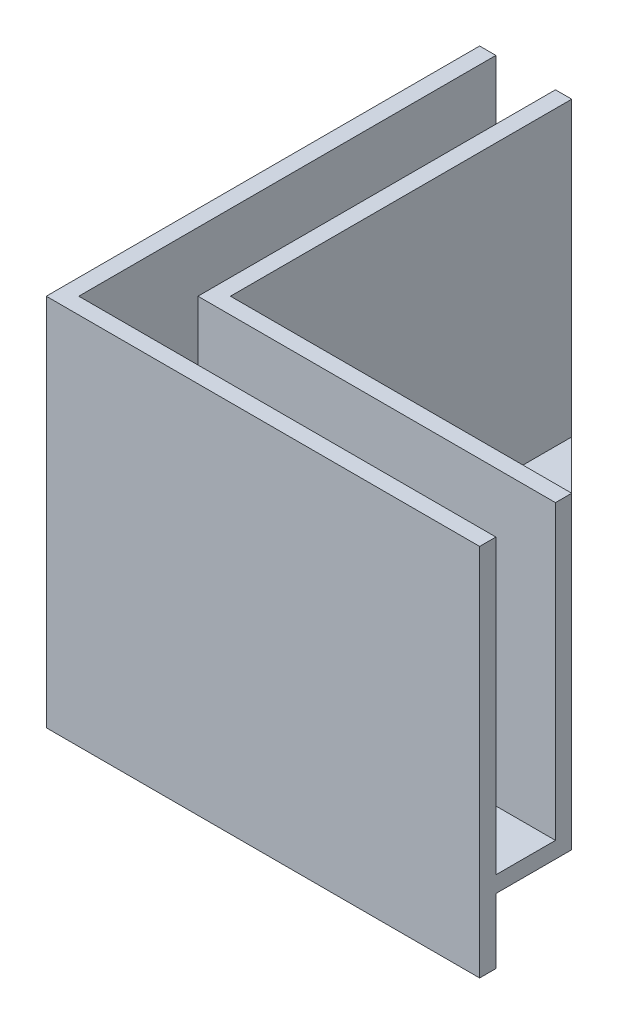
ISO-10303-21;
HEADER;
FILE_DESCRIPTION(('STEP AP214'),'2;1');
FILE_NAME('part.step','',(''),(''),'','','');
FILE_SCHEMA(('AUTOMOTIVE_DESIGN { 1 0 10303 214 1 1 1 1 }'));
ENDSEC;
DATA;
#1=APPLICATION_CONTEXT('core data for automotive mechanical design processes');
#2=APPLICATION_PROTOCOL_DEFINITION('international standard','automotive_design',2000,#1);
#3=PRODUCT_CONTEXT('',#1,'mechanical');
#4=PRODUCT('Part','Part','',(#3));
#5=PRODUCT_RELATED_PRODUCT_CATEGORY('part','',(#4));
#6=PRODUCT_DEFINITION_FORMATION('','',#4);
#7=PRODUCT_DEFINITION_CONTEXT('part definition',#1,'design');
#8=PRODUCT_DEFINITION('design','',#6,#7);
#9=PRODUCT_DEFINITION_SHAPE('','',#8);
#10=(LENGTH_UNIT() NAMED_UNIT(*) SI_UNIT(.MILLI.,.METRE.));
#11=(NAMED_UNIT(*) PLANE_ANGLE_UNIT() SI_UNIT($,.RADIAN.));
#12=(NAMED_UNIT(*) SI_UNIT($,.STERADIAN.) SOLID_ANGLE_UNIT());
#13=UNCERTAINTY_MEASURE_WITH_UNIT(LENGTH_MEASURE(1.E-05),#10,'distance_accuracy_value','');
#14=(GEOMETRIC_REPRESENTATION_CONTEXT(3) GLOBAL_UNCERTAINTY_ASSIGNED_CONTEXT((#13)) GLOBAL_UNIT_ASSIGNED_CONTEXT((#10,
#11,#12)) REPRESENTATION_CONTEXT('',''));
#15=CARTESIAN_POINT('',(0.,0.,0.));
#16=DIRECTION('',(0.,0.,1.));
#17=DIRECTION('',(1.,0.,0.));
#18=AXIS2_PLACEMENT_3D('',#15,#16,#17);
#19=CARTESIAN_POINT('',(0.,0.,0.));
#20=DIRECTION('',(0.,1.,0.));
#21=DIRECTION('',(0.,0.,1.));
#22=AXIS2_PLACEMENT_3D('',#19,#20,#21);
#23=PLANE('',#22);
#24=DIRECTION('',(-1.,0.,0.));
#25=VECTOR('',#24,1.);
#26=CARTESIAN_POINT('',(0.,0.,-20.));
#27=LINE('',#26,#25);
#28=CARTESIAN_POINT('',(4.25,0.,-20.));
#29=VERTEX_POINT('',#28);
#30=CARTESIAN_POINT('',(0.749999999999999,0.,-20.));
#31=VERTEX_POINT('',#30);
#32=EDGE_CURVE('E63',#29,#31,#27,.T.);
#33=ORIENTED_EDGE('',*,*,#32,.F.);
#34=DIRECTION('',(0.707106781186548,0.,0.707106781186548));
#35=VECTOR('',#34,1.);
#36=CARTESIAN_POINT('',(12.125,0.,-12.125));
#37=LINE('',#36,#35);
#38=CARTESIAN_POINT('',(20.,0.,-4.25));
#39=VERTEX_POINT('',#38);
#40=EDGE_CURVE('E352',#29,#39,#37,.T.);
#41=ORIENTED_EDGE('',*,*,#40,.T.);
#42=DIRECTION('',(0.,0.,-1.));
#43=VECTOR('',#42,1.);
#44=CARTESIAN_POINT('',(20.,0.,0.));
#45=LINE('',#44,#43);
#46=CARTESIAN_POINT('',(20.,0.,-0.750000000000001));
#47=VERTEX_POINT('',#46);
#48=EDGE_CURVE('E55',#47,#39,#45,.T.);
#49=ORIENTED_EDGE('',*,*,#48,.F.);
#50=DIRECTION('',(1.,0.,0.));
#51=VECTOR('',#50,1.);
#52=CARTESIAN_POINT('',(0.75,0.,-0.75));
#53=LINE('',#52,#51);
#54=CARTESIAN_POINT('',(0.75,0.,-0.75));
#55=VERTEX_POINT('',#54);
#56=EDGE_CURVE('E351',#55,#47,#53,.T.);
#57=ORIENTED_EDGE('',*,*,#56,.F.);
#58=DIRECTION('',(0.,0.,1.));
#59=VECTOR('',#58,1.);
#60=CARTESIAN_POINT('',(0.749999999999998,0.,-20.));
#61=LINE('',#60,#59);
#62=EDGE_CURVE('E347',#31,#55,#61,.T.);
#63=ORIENTED_EDGE('',*,*,#62,.F.);
#64=EDGE_LOOP('',(#33,#41,#49,#57,#63));
#65=FACE_BOUND('',#64,.T.);
#66=ADVANCED_FACE('F39',(#65),#23,.F.);
#67=CARTESIAN_POINT('',(20.,0.75,-4.25));
#68=DIRECTION('',(0.,0.,1.));
#69=DIRECTION('',(1.,0.,0.));
#70=AXIS2_PLACEMENT_3D('',#67,#68,#69);
#71=PLANE('',#70);
#72=DIRECTION('',(1.,0.,0.));
#73=VECTOR('',#72,1.);
#74=CARTESIAN_POINT('',(20.,0.75,-4.25));
#75=LINE('',#74,#73);
#76=CARTESIAN_POINT('',(4.25,0.75,-4.25));
#77=VERTEX_POINT('',#76);
#78=CARTESIAN_POINT('',(20.,0.75,-4.25));
#79=VERTEX_POINT('',#78);
#80=EDGE_CURVE('E176',#77,#79,#75,.T.);
#81=ORIENTED_EDGE('',*,*,#80,.F.);
#82=DIRECTION('',(0.,-1.,0.));
#83=VECTOR('',#82,1.);
#84=CARTESIAN_POINT('',(4.25,0.75,-4.25));
#85=LINE('',#84,#83);
#86=CARTESIAN_POINT('',(4.25,14.25,-4.25));
#87=VERTEX_POINT('',#86);
#88=EDGE_CURVE('E181',#87,#77,#85,.T.);
#89=ORIENTED_EDGE('',*,*,#88,.F.);
#90=DIRECTION('',(-1.,0.,0.));
#91=VECTOR('',#90,1.);
#92=CARTESIAN_POINT('',(20.,14.25,-4.25));
#93=LINE('',#92,#91);
#94=CARTESIAN_POINT('',(20.,14.25,-4.25));
#95=VERTEX_POINT('',#94);
#96=EDGE_CURVE('E179',#95,#87,#93,.T.);
#97=ORIENTED_EDGE('',*,*,#96,.F.);
#98=DIRECTION('',(0.,-1.,0.));
#99=VECTOR('',#98,1.);
#100=CARTESIAN_POINT('',(20.,0.75,-4.25));
#101=LINE('',#100,#99);
#102=EDGE_CURVE('E48',#95,#79,#101,.T.);
#103=ORIENTED_EDGE('',*,*,#102,.T.);
#104=EDGE_LOOP('',(#81,#89,#97,#103));
#105=FACE_BOUND('',#104,.T.);
#106=ADVANCED_FACE('F175',(#105),#71,.F.);
#107=CARTESIAN_POINT('',(4.25,0.75,-20.));
#108=DIRECTION('',(-1.,0.,0.));
#109=DIRECTION('',(0.,0.,1.));
#110=AXIS2_PLACEMENT_3D('',#107,#108,#109);
#111=PLANE('',#110);
#112=DIRECTION('',(0.,0.,1.));
#113=VECTOR('',#112,1.);
#114=CARTESIAN_POINT('',(4.25,0.75,-20.));
#115=LINE('',#114,#113);
#116=CARTESIAN_POINT('',(4.25,0.75,-20.));
#117=VERTEX_POINT('',#116);
#118=EDGE_CURVE('E183',#117,#77,#115,.T.);
#119=ORIENTED_EDGE('',*,*,#118,.F.);
#120=DIRECTION('',(0.,-1.,0.));
#121=VECTOR('',#120,1.);
#122=CARTESIAN_POINT('',(4.25,0.75,-20.));
#123=LINE('',#122,#121);
#124=CARTESIAN_POINT('',(4.25,14.25,-20.));
#125=VERTEX_POINT('',#124);
#126=EDGE_CURVE('E287',#125,#117,#123,.T.);
#127=ORIENTED_EDGE('',*,*,#126,.F.);
#128=DIRECTION('',(0.,0.,-1.));
#129=VECTOR('',#128,1.);
#130=CARTESIAN_POINT('',(4.25,14.25,-4.25));
#131=LINE('',#130,#129);
#132=EDGE_CURVE('E249',#87,#125,#131,.T.);
#133=ORIENTED_EDGE('',*,*,#132,.F.);
#134=ORIENTED_EDGE('',*,*,#88,.T.);
#135=EDGE_LOOP('',(#119,#127,#133,#134));
#136=FACE_BOUND('',#135,.T.);
#137=ADVANCED_FACE('F294',(#136),#111,.F.);
#138=CARTESIAN_POINT('',(0.,0.75,0.));
#139=DIRECTION('',(0.,1.,0.));
#140=DIRECTION('',(0.,0.,1.));
#141=AXIS2_PLACEMENT_3D('',#138,#139,#140);
#142=PLANE('',#141);
#143=DIRECTION('',(0.,0.,-1.));
#144=VECTOR('',#143,1.);
#145=CARTESIAN_POINT('',(0.749999999999998,0.75,-20.));
#146=LINE('',#145,#144);
#147=CARTESIAN_POINT('',(0.75,0.75,-0.75));
#148=VERTEX_POINT('',#147);
#149=CARTESIAN_POINT('',(0.749999999999998,0.75,-20.));
#150=VERTEX_POINT('',#149);
#151=EDGE_CURVE('E190',#148,#150,#146,.T.);
#152=ORIENTED_EDGE('',*,*,#151,.F.);
#153=DIRECTION('',(-1.,0.,0.));
#154=VECTOR('',#153,1.);
#155=CARTESIAN_POINT('',(0.75,0.75,-0.75));
#156=LINE('',#155,#154);
#157=CARTESIAN_POINT('',(20.,0.75,-0.750000000000001));
#158=VERTEX_POINT('',#157);
#159=EDGE_CURVE('E185',#158,#148,#156,.T.);
#160=ORIENTED_EDGE('',*,*,#159,.F.);
#161=DIRECTION('',(0.,0.,-1.));
#162=VECTOR('',#161,1.);
#163=CARTESIAN_POINT('',(20.,0.75,0.));
#164=LINE('',#163,#162);
#165=CARTESIAN_POINT('',(20.,0.75,-3.5));
#166=VERTEX_POINT('',#165);
#167=EDGE_CURVE('E271',#158,#166,#164,.T.);
#168=ORIENTED_EDGE('',*,*,#167,.T.);
#169=DIRECTION('',(1.,0.,0.));
#170=VECTOR('',#169,1.);
#171=CARTESIAN_POINT('',(20.,0.75,-3.5));
#172=LINE('',#171,#170);
#173=CARTESIAN_POINT('',(3.5,0.75,-3.5));
#174=VERTEX_POINT('',#173);
#175=EDGE_CURVE('E238',#174,#166,#172,.T.);
#176=ORIENTED_EDGE('',*,*,#175,.F.);
#177=DIRECTION('',(0.,0.,1.));
#178=VECTOR('',#177,1.);
#179=CARTESIAN_POINT('',(3.5,0.75,-3.5));
#180=LINE('',#179,#178);
#181=CARTESIAN_POINT('',(3.5,0.75,-20.));
#182=VERTEX_POINT('',#181);
#183=EDGE_CURVE('E232',#182,#174,#180,.T.);
#184=ORIENTED_EDGE('',*,*,#183,.F.);
#185=DIRECTION('',(-1.,0.,0.));
#186=VECTOR('',#185,1.);
#187=CARTESIAN_POINT('',(0.,0.75,-20.));
#188=LINE('',#187,#186);
#189=EDGE_CURVE('E274',#182,#150,#188,.T.);
#190=ORIENTED_EDGE('',*,*,#189,.T.);
#191=EDGE_LOOP('',(#152,#160,#168,#176,#184,#190));
#192=FACE_BOUND('',#191,.T.);
#193=ADVANCED_FACE('F306',(#192),#142,.T.);
#194=CARTESIAN_POINT('',(0.,0.75,0.));
#195=DIRECTION('',(0.,0.,-1.));
#196=DIRECTION('',(-1.,0.,0.));
#197=AXIS2_PLACEMENT_3D('',#194,#195,#196);
#198=PLANE('',#197);
#199=DIRECTION('',(0.,-1.,0.));
#200=VECTOR('',#199,1.);
#201=CARTESIAN_POINT('',(0.,0.75,0.));
#202=LINE('',#201,#200);
#203=CARTESIAN_POINT('',(0.,14.25,0.));
#204=VERTEX_POINT('',#203);
#205=CARTESIAN_POINT('',(0.,-3.,0.));
#206=VERTEX_POINT('',#205);
#207=EDGE_CURVE('E277',#204,#206,#202,.T.);
#208=ORIENTED_EDGE('',*,*,#207,.T.);
#209=DIRECTION('',(-1.,0.,0.));
#210=VECTOR('',#209,1.);
#211=CARTESIAN_POINT('',(20.,-3.,0.));
#212=LINE('',#211,#210);
#213=CARTESIAN_POINT('',(20.,-3.,0.));
#214=VERTEX_POINT('',#213);
#215=EDGE_CURVE('E331',#214,#206,#212,.T.);
#216=ORIENTED_EDGE('',*,*,#215,.F.);
#217=DIRECTION('',(0.,-1.,0.));
#218=VECTOR('',#217,1.);
#219=CARTESIAN_POINT('',(20.,0.75,0.));
#220=LINE('',#219,#218);
#221=CARTESIAN_POINT('',(20.,14.25,0.));
#222=VERTEX_POINT('',#221);
#223=EDGE_CURVE('E11',#222,#214,#220,.T.);
#224=ORIENTED_EDGE('',*,*,#223,.F.);
#225=DIRECTION('',(1.,0.,0.));
#226=VECTOR('',#225,1.);
#227=CARTESIAN_POINT('',(0.,14.25,0.));
#228=LINE('',#227,#226);
#229=EDGE_CURVE('E200',#204,#222,#228,.T.);
#230=ORIENTED_EDGE('',*,*,#229,.F.);
#231=EDGE_LOOP('',(#208,#216,#224,#230));
#232=FACE_BOUND('',#231,.T.);
#233=ADVANCED_FACE('F41',(#232),#198,.F.);
#234=CARTESIAN_POINT('',(20.,0.75,0.));
#235=DIRECTION('',(-1.,0.,0.));
#236=DIRECTION('',(0.,0.,1.));
#237=AXIS2_PLACEMENT_3D('',#234,#235,#236);
#238=PLANE('',#237);
#239=ORIENTED_EDGE('',*,*,#48,.T.);
#240=DIRECTION('',(0.,1.,0.));
#241=VECTOR('',#240,1.);
#242=CARTESIAN_POINT('',(20.,-3.,-4.25));
#243=LINE('',#242,#241);
#244=EDGE_CURVE('E157',#39,#79,#243,.T.);
#245=ORIENTED_EDGE('',*,*,#244,.T.);
#246=ORIENTED_EDGE('',*,*,#102,.F.);
#247=DIRECTION('',(0.,0.,-1.));
#248=VECTOR('',#247,1.);
#249=CARTESIAN_POINT('',(20.,14.25,-3.5));
#250=LINE('',#249,#248);
#251=CARTESIAN_POINT('',(20.,14.25,-3.5));
#252=VERTEX_POINT('',#251);
#253=EDGE_CURVE('E244',#252,#95,#250,.T.);
#254=ORIENTED_EDGE('',*,*,#253,.F.);
#255=DIRECTION('',(0.,-1.,0.));
#256=VECTOR('',#255,1.);
#257=CARTESIAN_POINT('',(20.,14.25,-3.5));
#258=LINE('',#257,#256);
#259=EDGE_CURVE('E253',#252,#166,#258,.T.);
#260=ORIENTED_EDGE('',*,*,#259,.T.);
#261=ORIENTED_EDGE('',*,*,#167,.F.);
#262=DIRECTION('',(0.,-1.,0.));
#263=VECTOR('',#262,1.);
#264=CARTESIAN_POINT('',(20.,14.25,-0.750000000000001));
#265=LINE('',#264,#263);
#266=CARTESIAN_POINT('',(20.,14.25,-0.750000000000001));
#267=VERTEX_POINT('',#266);
#268=EDGE_CURVE('E228',#267,#158,#265,.T.);
#269=ORIENTED_EDGE('',*,*,#268,.F.);
#270=DIRECTION('',(0.,0.,-1.));
#271=VECTOR('',#270,1.);
#272=CARTESIAN_POINT('',(20.,14.25,0.));
#273=LINE('',#272,#271);
#274=EDGE_CURVE('E204',#222,#267,#273,.T.);
#275=ORIENTED_EDGE('',*,*,#274,.F.);
#276=ORIENTED_EDGE('',*,*,#223,.T.);
#277=DIRECTION('',(0.,0.,1.));
#278=VECTOR('',#277,1.);
#279=CARTESIAN_POINT('',(20.,-3.,-0.750000000000001));
#280=LINE('',#279,#278);
#281=CARTESIAN_POINT('',(20.,-3.,-0.750000000000001));
#282=VERTEX_POINT('',#281);
#283=EDGE_CURVE('E337',#282,#214,#280,.T.);
#284=ORIENTED_EDGE('',*,*,#283,.F.);
#285=DIRECTION('',(0.,1.,0.));
#286=VECTOR('',#285,1.);
#287=CARTESIAN_POINT('',(20.,-3.,-0.750000000000001));
#288=LINE('',#287,#286);
#289=EDGE_CURVE('E341',#282,#47,#288,.T.);
#290=ORIENTED_EDGE('',*,*,#289,.T.);
#291=EDGE_LOOP('',(#239,#245,#246,#254,#260,#261,#269,#275,#276,#284,#290));
#292=FACE_BOUND('',#291,.T.);
#293=ADVANCED_FACE('F167',(#292),#238,.F.);
#294=CARTESIAN_POINT('',(0.,0.75,-20.));
#295=DIRECTION('',(0.,0.,1.));
#296=DIRECTION('',(1.,0.,0.));
#297=AXIS2_PLACEMENT_3D('',#294,#295,#296);
#298=PLANE('',#297);
#299=ORIENTED_EDGE('',*,*,#126,.T.);
#300=DIRECTION('',(0.,1.,0.));
#301=VECTOR('',#300,1.);
#302=CARTESIAN_POINT('',(4.25,-3.,-20.));
#303=LINE('',#302,#301);
#304=EDGE_CURVE('E158',#29,#117,#303,.T.);
#305=ORIENTED_EDGE('',*,*,#304,.F.);
#306=ORIENTED_EDGE('',*,*,#32,.T.);
#307=DIRECTION('',(0.,1.,0.));
#308=VECTOR('',#307,1.);
#309=CARTESIAN_POINT('',(0.749999999999998,-3.,-20.));
#310=LINE('',#309,#308);
#311=CARTESIAN_POINT('',(0.749999999999998,-3.,-20.));
#312=VERTEX_POINT('',#311);
#313=EDGE_CURVE('E192',#312,#31,#310,.T.);
#314=ORIENTED_EDGE('',*,*,#313,.F.);
#315=DIRECTION('',(1.,0.,0.));
#316=VECTOR('',#315,1.);
#317=CARTESIAN_POINT('',(0.,-3.,-20.));
#318=LINE('',#317,#316);
#319=CARTESIAN_POINT('',(0.,-3.,-20.));
#320=VERTEX_POINT('',#319);
#321=EDGE_CURVE('E355',#320,#312,#318,.T.);
#322=ORIENTED_EDGE('',*,*,#321,.F.);
#323=DIRECTION('',(0.,-1.,0.));
#324=VECTOR('',#323,1.);
#325=CARTESIAN_POINT('',(0.,0.75,-20.));
#326=LINE('',#325,#324);
#327=CARTESIAN_POINT('',(0.,14.25,-20.));
#328=VERTEX_POINT('',#327);
#329=EDGE_CURVE('E284',#328,#320,#326,.T.);
#330=ORIENTED_EDGE('',*,*,#329,.F.);
#331=DIRECTION('',(-1.,0.,0.));
#332=VECTOR('',#331,1.);
#333=CARTESIAN_POINT('',(0.749999999999998,14.25,-20.));
#334=LINE('',#333,#332);
#335=CARTESIAN_POINT('',(0.749999999999998,14.25,-20.));
#336=VERTEX_POINT('',#335);
#337=EDGE_CURVE('E213',#336,#328,#334,.T.);
#338=ORIENTED_EDGE('',*,*,#337,.F.);
#339=DIRECTION('',(0.,-1.,0.));
#340=VECTOR('',#339,1.);
#341=CARTESIAN_POINT('',(0.749999999999998,14.25,-20.));
#342=LINE('',#341,#340);
#343=EDGE_CURVE('E216',#336,#150,#342,.T.);
#344=ORIENTED_EDGE('',*,*,#343,.T.);
#345=ORIENTED_EDGE('',*,*,#189,.F.);
#346=DIRECTION('',(0.,-1.,0.));
#347=VECTOR('',#346,1.);
#348=CARTESIAN_POINT('',(3.5,14.25,-20.));
#349=LINE('',#348,#347);
#350=CARTESIAN_POINT('',(3.5,14.25,-20.));
#351=VERTEX_POINT('',#350);
#352=EDGE_CURVE('E267',#351,#182,#349,.T.);
#353=ORIENTED_EDGE('',*,*,#352,.F.);
#354=DIRECTION('',(-1.,0.,0.));
#355=VECTOR('',#354,1.);
#356=CARTESIAN_POINT('',(4.25,14.25,-20.));
#357=LINE('',#356,#355);
#358=EDGE_CURVE('E233',#125,#351,#357,.T.);
#359=ORIENTED_EDGE('',*,*,#358,.F.);
#360=EDGE_LOOP('',(#299,#305,#306,#314,#322,#330,#338,#344,#345,#353,#359));
#361=FACE_BOUND('',#360,.T.);
#362=ADVANCED_FACE('F311',(#361),#298,.F.);
#363=CARTESIAN_POINT('',(0.,0.75,0.));
#364=DIRECTION('',(1.,0.,0.));
#365=DIRECTION('',(0.,0.,-1.));
#366=AXIS2_PLACEMENT_3D('',#363,#364,#365);
#367=PLANE('',#366);
#368=ORIENTED_EDGE('',*,*,#329,.T.);
#369=DIRECTION('',(0.,0.,-1.));
#370=VECTOR('',#369,1.);
#371=CARTESIAN_POINT('',(0.,-3.,0.));
#372=LINE('',#371,#370);
#373=EDGE_CURVE('E336',#206,#320,#372,.T.);
#374=ORIENTED_EDGE('',*,*,#373,.F.);
#375=ORIENTED_EDGE('',*,*,#207,.F.);
#376=DIRECTION('',(0.,0.,1.));
#377=VECTOR('',#376,1.);
#378=CARTESIAN_POINT('',(0.,14.25,-20.));
#379=LINE('',#378,#377);
#380=EDGE_CURVE('E196',#328,#204,#379,.T.);
#381=ORIENTED_EDGE('',*,*,#380,.F.);
#382=EDGE_LOOP('',(#368,#374,#375,#381));
#383=FACE_BOUND('',#382,.T.);
#384=ADVANCED_FACE('F392',(#383),#367,.F.);
#385=CARTESIAN_POINT('',(3.5,14.25,-3.5));
#386=DIRECTION('',(1.,0.,0.));
#387=DIRECTION('',(0.,0.,-1.));
#388=AXIS2_PLACEMENT_3D('',#385,#386,#387);
#389=PLANE('',#388);
#390=ORIENTED_EDGE('',*,*,#183,.T.);
#391=DIRECTION('',(0.,-1.,0.));
#392=VECTOR('',#391,1.);
#393=CARTESIAN_POINT('',(3.5,14.25,-3.5));
#394=LINE('',#393,#392);
#395=CARTESIAN_POINT('',(3.5,14.25,-3.5));
#396=VERTEX_POINT('',#395);
#397=EDGE_CURVE('E263',#396,#174,#394,.T.);
#398=ORIENTED_EDGE('',*,*,#397,.F.);
#399=DIRECTION('',(0.,0.,1.));
#400=VECTOR('',#399,1.);
#401=CARTESIAN_POINT('',(3.5,14.25,-3.5));
#402=LINE('',#401,#400);
#403=EDGE_CURVE('E237',#351,#396,#402,.T.);
#404=ORIENTED_EDGE('',*,*,#403,.F.);
#405=ORIENTED_EDGE('',*,*,#352,.T.);
#406=EDGE_LOOP('',(#390,#398,#404,#405));
#407=FACE_BOUND('',#406,.T.);
#408=ADVANCED_FACE('F309',(#407),#389,.F.);
#409=CARTESIAN_POINT('',(20.,14.25,-3.5));
#410=DIRECTION('',(0.,0.,-1.));
#411=DIRECTION('',(-1.,0.,0.));
#412=AXIS2_PLACEMENT_3D('',#409,#410,#411);
#413=PLANE('',#412);
#414=ORIENTED_EDGE('',*,*,#175,.T.);
#415=ORIENTED_EDGE('',*,*,#259,.F.);
#416=DIRECTION('',(1.,0.,0.));
#417=VECTOR('',#416,1.);
#418=CARTESIAN_POINT('',(20.,14.25,-3.5));
#419=LINE('',#418,#417);
#420=EDGE_CURVE('E241',#396,#252,#419,.T.);
#421=ORIENTED_EDGE('',*,*,#420,.F.);
#422=ORIENTED_EDGE('',*,*,#397,.T.);
#423=EDGE_LOOP('',(#414,#415,#421,#422));
#424=FACE_BOUND('',#423,.T.);
#425=ADVANCED_FACE('F303',(#424),#413,.F.);
#426=CARTESIAN_POINT('',(0.,14.25,0.));
#427=DIRECTION('',(0.,-1.,0.));
#428=DIRECTION('',(0.,0.,-1.));
#429=AXIS2_PLACEMENT_3D('',#426,#427,#428);
#430=PLANE('',#429);
#431=ORIENTED_EDGE('',*,*,#358,.T.);
#432=ORIENTED_EDGE('',*,*,#403,.T.);
#433=ORIENTED_EDGE('',*,*,#420,.T.);
#434=ORIENTED_EDGE('',*,*,#253,.T.);
#435=ORIENTED_EDGE('',*,*,#96,.T.);
#436=ORIENTED_EDGE('',*,*,#132,.T.);
#437=EDGE_LOOP('',(#431,#432,#433,#434,#435,#436));
#438=FACE_BOUND('',#437,.T.);
#439=ADVANCED_FACE('F296',(#438),#430,.F.);
#440=CARTESIAN_POINT('',(0.75,14.25,-0.75));
#441=DIRECTION('',(0.,0.,1.));
#442=DIRECTION('',(1.,0.,0.));
#443=AXIS2_PLACEMENT_3D('',#440,#441,#442);
#444=PLANE('',#443);
#445=ORIENTED_EDGE('',*,*,#159,.T.);
#446=DIRECTION('',(0.,-1.,0.));
#447=VECTOR('',#446,1.);
#448=CARTESIAN_POINT('',(0.75,14.25,-0.75));
#449=LINE('',#448,#447);
#450=CARTESIAN_POINT('',(0.75,14.25,-0.75));
#451=VERTEX_POINT('',#450);
#452=EDGE_CURVE('E224',#451,#148,#449,.T.);
#453=ORIENTED_EDGE('',*,*,#452,.F.);
#454=DIRECTION('',(-1.,0.,0.));
#455=VECTOR('',#454,1.);
#456=CARTESIAN_POINT('',(0.75,14.25,-0.75));
#457=LINE('',#456,#455);
#458=EDGE_CURVE('E207',#267,#451,#457,.T.);
#459=ORIENTED_EDGE('',*,*,#458,.F.);
#460=ORIENTED_EDGE('',*,*,#268,.T.);
#461=EDGE_LOOP('',(#445,#453,#459,#460));
#462=FACE_BOUND('',#461,.T.);
#463=ADVANCED_FACE('F320',(#462),#444,.F.);
#464=CARTESIAN_POINT('',(0.749999999999998,14.25,-20.));
#465=DIRECTION('',(-1.,0.,0.));
#466=DIRECTION('',(0.,0.,1.));
#467=AXIS2_PLACEMENT_3D('',#464,#465,#466);
#468=PLANE('',#467);
#469=ORIENTED_EDGE('',*,*,#151,.T.);
#470=ORIENTED_EDGE('',*,*,#343,.F.);
#471=DIRECTION('',(0.,0.,-1.));
#472=VECTOR('',#471,1.);
#473=CARTESIAN_POINT('',(0.749999999999998,14.25,-20.));
#474=LINE('',#473,#472);
#475=EDGE_CURVE('E210',#451,#336,#474,.T.);
#476=ORIENTED_EDGE('',*,*,#475,.F.);
#477=ORIENTED_EDGE('',*,*,#452,.T.);
#478=EDGE_LOOP('',(#469,#470,#476,#477));
#479=FACE_BOUND('',#478,.T.);
#480=ADVANCED_FACE('F315',(#479),#468,.F.);
#481=CARTESIAN_POINT('',(0.,14.25,0.));
#482=DIRECTION('',(0.,1.,0.));
#483=DIRECTION('',(0.,0.,1.));
#484=AXIS2_PLACEMENT_3D('',#481,#482,#483);
#485=PLANE('',#484);
#486=ORIENTED_EDGE('',*,*,#380,.T.);
#487=ORIENTED_EDGE('',*,*,#229,.T.);
#488=ORIENTED_EDGE('',*,*,#274,.T.);
#489=ORIENTED_EDGE('',*,*,#458,.T.);
#490=ORIENTED_EDGE('',*,*,#475,.T.);
#491=ORIENTED_EDGE('',*,*,#337,.T.);
#492=EDGE_LOOP('',(#486,#487,#488,#489,#490,#491));
#493=FACE_BOUND('',#492,.T.);
#494=ADVANCED_FACE('F325',(#493),#485,.T.);
#495=CARTESIAN_POINT('',(0.,0.75,0.));
#496=DIRECTION('',(0.,-1.,0.));
#497=DIRECTION('',(0.,0.,-1.));
#498=AXIS2_PLACEMENT_3D('',#495,#496,#497);
#499=PLANE('',#498);
#500=ORIENTED_EDGE('',*,*,#80,.T.);
#501=DIRECTION('',(0.707106781186547,0.,0.707106781186547));
#502=VECTOR('',#501,1.);
#503=CARTESIAN_POINT('',(20.,0.75,-4.25));
#504=LINE('',#503,#502);
#505=EDGE_CURVE('E154',#117,#79,#504,.T.);
#506=ORIENTED_EDGE('',*,*,#505,.F.);
#507=ORIENTED_EDGE('',*,*,#118,.T.);
#508=EDGE_LOOP('',(#500,#506,#507));
#509=FACE_BOUND('',#508,.T.);
#510=ADVANCED_FACE('F182',(#509),#499,.F.);
#511=CARTESIAN_POINT('',(0.749999999999998,-3.,-20.));
#512=DIRECTION('',(-1.,0.,0.));
#513=DIRECTION('',(0.,0.,1.));
#514=AXIS2_PLACEMENT_3D('',#511,#512,#513);
#515=PLANE('',#514);
#516=ORIENTED_EDGE('',*,*,#62,.T.);
#517=DIRECTION('',(0.,1.,0.));
#518=VECTOR('',#517,1.);
#519=CARTESIAN_POINT('',(0.75,-3.,-0.75));
#520=LINE('',#519,#518);
#521=CARTESIAN_POINT('',(0.75,-3.,-0.75));
#522=VERTEX_POINT('',#521);
#523=EDGE_CURVE('E358',#522,#55,#520,.T.);
#524=ORIENTED_EDGE('',*,*,#523,.F.);
#525=DIRECTION('',(0.,0.,1.));
#526=VECTOR('',#525,1.);
#527=CARTESIAN_POINT('',(0.749999999999998,-3.,-20.));
#528=LINE('',#527,#526);
#529=EDGE_CURVE('E366',#312,#522,#528,.T.);
#530=ORIENTED_EDGE('',*,*,#529,.F.);
#531=ORIENTED_EDGE('',*,*,#313,.T.);
#532=EDGE_LOOP('',(#516,#524,#530,#531));
#533=FACE_BOUND('',#532,.T.);
#534=ADVANCED_FACE('F364',(#533),#515,.F.);
#535=CARTESIAN_POINT('',(0.75,-3.,-0.75));
#536=DIRECTION('',(0.,0.,1.));
#537=DIRECTION('',(1.,0.,0.));
#538=AXIS2_PLACEMENT_3D('',#535,#536,#537);
#539=PLANE('',#538);
#540=ORIENTED_EDGE('',*,*,#56,.T.);
#541=ORIENTED_EDGE('',*,*,#289,.F.);
#542=DIRECTION('',(1.,0.,0.));
#543=VECTOR('',#542,1.);
#544=CARTESIAN_POINT('',(0.75,-3.,-0.75));
#545=LINE('',#544,#543);
#546=EDGE_CURVE('E343',#522,#282,#545,.T.);
#547=ORIENTED_EDGE('',*,*,#546,.F.);
#548=ORIENTED_EDGE('',*,*,#523,.T.);
#549=EDGE_LOOP('',(#540,#541,#547,#548));
#550=FACE_BOUND('',#549,.T.);
#551=ADVANCED_FACE('F379',(#550),#539,.F.);
#552=CARTESIAN_POINT('',(0.,-3.,0.));
#553=DIRECTION('',(0.,-1.,0.));
#554=DIRECTION('',(0.,0.,-1.));
#555=AXIS2_PLACEMENT_3D('',#552,#553,#554);
#556=PLANE('',#555);
#557=ORIENTED_EDGE('',*,*,#321,.T.);
#558=ORIENTED_EDGE('',*,*,#529,.T.);
#559=ORIENTED_EDGE('',*,*,#546,.T.);
#560=ORIENTED_EDGE('',*,*,#283,.T.);
#561=ORIENTED_EDGE('',*,*,#215,.T.);
#562=ORIENTED_EDGE('',*,*,#373,.T.);
#563=EDGE_LOOP('',(#557,#558,#559,#560,#561,#562));
#564=FACE_BOUND('',#563,.T.);
#565=ADVANCED_FACE('F377',(#564),#556,.T.);
#566=CARTESIAN_POINT('',(20.,-3.,-4.25));
#567=DIRECTION('',(-0.707106781186547,0.,0.707106781186547));
#568=DIRECTION('',(0.707106781186548,0.,0.707106781186548));
#569=AXIS2_PLACEMENT_3D('',#566,#567,#568);
#570=PLANE('',#569);
#571=ORIENTED_EDGE('',*,*,#304,.T.);
#572=ORIENTED_EDGE('',*,*,#505,.T.);
#573=ORIENTED_EDGE('',*,*,#244,.F.);
#574=ORIENTED_EDGE('',*,*,#40,.F.);
#575=EDGE_LOOP('',(#571,#572,#573,#574));
#576=FACE_BOUND('',#575,.T.);
#577=ADVANCED_FACE('F156',(#576),#570,.F.);
#578=CLOSED_SHELL('',(#66,#106,#137,#193,#233,#293,#362,#384,#408,#425,#439,#463,#480,#494,#510,
#534,#551,#565,#577));
#579=MANIFOLD_SOLID_BREP('B2',#578);
#580=ADVANCED_BREP_SHAPE_REPRESENTATION('',(#18,#579),#14);
#581=SHAPE_DEFINITION_REPRESENTATION(#9,#580);
ENDSEC;
END-ISO-10303-21;
